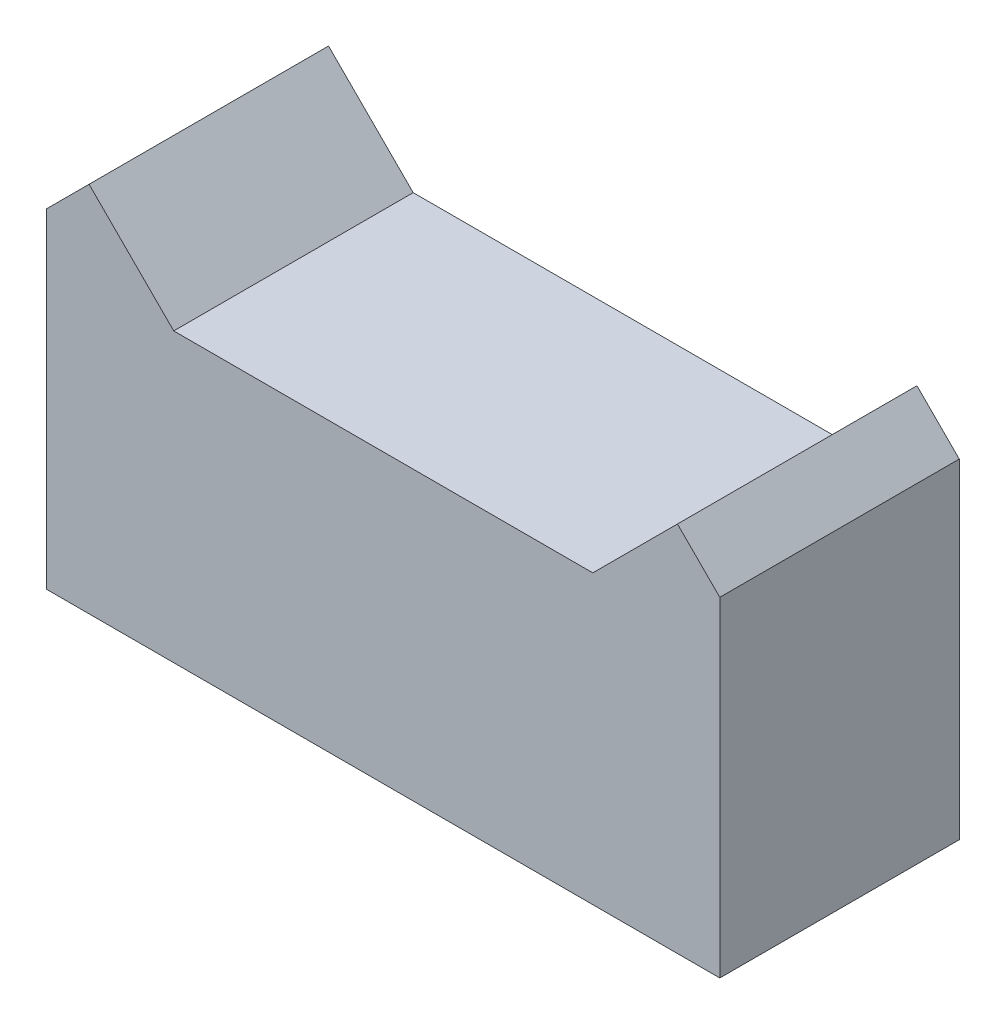
ISO-10303-21;
HEADER;
FILE_DESCRIPTION(('STEP AP214'),'2;1');
FILE_NAME('part.step','',(''),(''),'','','');
FILE_SCHEMA(('AUTOMOTIVE_DESIGN { 1 0 10303 214 1 1 1 1 }'));
ENDSEC;
DATA;
#1=APPLICATION_CONTEXT('core data for automotive mechanical design processes');
#2=APPLICATION_PROTOCOL_DEFINITION('international standard','automotive_design',2000,#1);
#3=PRODUCT_CONTEXT('',#1,'mechanical');
#4=PRODUCT('Part','Part','',(#3));
#5=PRODUCT_RELATED_PRODUCT_CATEGORY('part','',(#4));
#6=PRODUCT_DEFINITION_FORMATION('','',#4);
#7=PRODUCT_DEFINITION_CONTEXT('part definition',#1,'design');
#8=PRODUCT_DEFINITION('design','',#6,#7);
#9=PRODUCT_DEFINITION_SHAPE('','',#8);
#10=(LENGTH_UNIT() NAMED_UNIT(*) SI_UNIT(.MILLI.,.METRE.));
#11=(NAMED_UNIT(*) PLANE_ANGLE_UNIT() SI_UNIT($,.RADIAN.));
#12=(NAMED_UNIT(*) SI_UNIT($,.STERADIAN.) SOLID_ANGLE_UNIT());
#13=UNCERTAINTY_MEASURE_WITH_UNIT(LENGTH_MEASURE(1.E-05),#10,'distance_accuracy_value','');
#14=(GEOMETRIC_REPRESENTATION_CONTEXT(3) GLOBAL_UNCERTAINTY_ASSIGNED_CONTEXT((#13)) GLOBAL_UNIT_ASSIGNED_CONTEXT((#10,
#11,#12)) REPRESENTATION_CONTEXT('',''));
#15=CARTESIAN_POINT('',(0.,0.,0.));
#16=DIRECTION('',(0.,0.,1.));
#17=DIRECTION('',(1.,0.,0.));
#18=AXIS2_PLACEMENT_3D('',#15,#16,#17);
#19=CARTESIAN_POINT('',(0.,0.,-10.));
#20=DIRECTION('',(0.,0.,1.));
#21=DIRECTION('',(1.,0.,0.));
#22=AXIS2_PLACEMENT_3D('',#19,#20,#21);
#23=PLANE('',#22);
#24=DIRECTION('',(1.,0.,0.));
#25=VECTOR('',#24,1.);
#26=CARTESIAN_POINT('',(0.,-45.,-10.));
#27=LINE('',#26,#25);
#28=CARTESIAN_POINT('',(-28.1066017177982,-45.,-10.));
#29=VERTEX_POINT('',#28);
#30=CARTESIAN_POINT('',(28.1066017177982,-45.,-10.));
#31=VERTEX_POINT('',#30);
#32=EDGE_CURVE('E188',#29,#31,#27,.T.);
#33=ORIENTED_EDGE('',*,*,#32,.F.);
#34=DIRECTION('',(0.,-1.,0.));
#35=VECTOR('',#34,1.);
#36=CARTESIAN_POINT('',(-28.1066017177982,0.,-10.));
#37=LINE('',#36,#35);
#38=CARTESIAN_POINT('',(-28.1066017177982,-17.4644660940672,-10.));
#39=VERTEX_POINT('',#38);
#40=EDGE_CURVE('E204',#39,#29,#37,.T.);
#41=ORIENTED_EDGE('',*,*,#40,.F.);
#42=DIRECTION('',(-0.707106781186548,-0.707106781186548,0.));
#43=VECTOR('',#42,1.);
#44=CARTESIAN_POINT('',(-5.32106781186547,5.32106781186547,-10.));
#45=LINE('',#44,#43);
#46=CARTESIAN_POINT('',(-24.5710678118655,-13.9289321881345,-10.));
#47=VERTEX_POINT('',#46);
#48=EDGE_CURVE('E201',#47,#39,#45,.T.);
#49=ORIENTED_EDGE('',*,*,#48,.F.);
#50=DIRECTION('',(-0.707106781186548,0.707106781186547,0.));
#51=VECTOR('',#50,1.);
#52=CARTESIAN_POINT('',(-19.25,-19.25,-10.));
#53=LINE('',#52,#51);
#54=CARTESIAN_POINT('',(-17.5,-21.,-10.));
#55=VERTEX_POINT('',#54);
#56=EDGE_CURVE('E198',#55,#47,#53,.T.);
#57=ORIENTED_EDGE('',*,*,#56,.F.);
#58=DIRECTION('',(1.,0.,0.));
#59=VECTOR('',#58,1.);
#60=CARTESIAN_POINT('',(0.,-21.,-10.));
#61=LINE('',#60,#59);
#62=CARTESIAN_POINT('',(17.5,-21.,-10.));
#63=VERTEX_POINT('',#62);
#64=EDGE_CURVE('E196',#55,#63,#61,.T.);
#65=ORIENTED_EDGE('',*,*,#64,.T.);
#66=DIRECTION('',(0.707106781186548,0.707106781186548,0.));
#67=VECTOR('',#66,1.);
#68=CARTESIAN_POINT('',(19.25,-19.25,-10.));
#69=LINE('',#68,#67);
#70=CARTESIAN_POINT('',(24.5710678118655,-13.9289321881345,-10.));
#71=VERTEX_POINT('',#70);
#72=EDGE_CURVE('E194',#63,#71,#69,.T.);
#73=ORIENTED_EDGE('',*,*,#72,.T.);
#74=DIRECTION('',(0.707106781186548,-0.707106781186547,0.));
#75=VECTOR('',#74,1.);
#76=CARTESIAN_POINT('',(5.32106781186547,5.32106781186547,-10.));
#77=LINE('',#76,#75);
#78=CARTESIAN_POINT('',(28.1066017177982,-17.4644660940673,-10.));
#79=VERTEX_POINT('',#78);
#80=EDGE_CURVE('E192',#71,#79,#77,.T.);
#81=ORIENTED_EDGE('',*,*,#80,.T.);
#82=DIRECTION('',(0.,-1.,0.));
#83=VECTOR('',#82,1.);
#84=CARTESIAN_POINT('',(28.1066017177982,0.,-10.));
#85=LINE('',#84,#83);
#86=EDGE_CURVE('E190',#79,#31,#85,.T.);
#87=ORIENTED_EDGE('',*,*,#86,.T.);
#88=EDGE_LOOP('',(#33,#41,#49,#57,#65,#73,#81,#87));
#89=FACE_BOUND('',#88,.T.);
#90=DIRECTION('',(-1.,0.,0.));
#91=VECTOR('',#90,1.);
#92=CARTESIAN_POINT('',(0.,-33.,-10.));
#93=LINE('',#92,#91);
#94=CARTESIAN_POINT('',(9.98477558685093,-33.,-10.));
#95=VERTEX_POINT('',#94);
#96=CARTESIAN_POINT('',(-10.,-33.,-10.));
#97=VERTEX_POINT('',#96);
#98=EDGE_CURVE('E53',#95,#97,#93,.T.);
#99=ORIENTED_EDGE('',*,*,#98,.T.);
#100=DIRECTION('',(0.,-1.,0.));
#101=VECTOR('',#100,1.);
#102=CARTESIAN_POINT('',(-10.,0.,-10.));
#103=LINE('',#102,#101);
#104=CARTESIAN_POINT('',(-10.,-36.,-10.));
#105=VERTEX_POINT('',#104);
#106=EDGE_CURVE('E146',#97,#105,#103,.T.);
#107=ORIENTED_EDGE('',*,*,#106,.T.);
#108=DIRECTION('',(1.,0.,0.));
#109=VECTOR('',#108,1.);
#110=CARTESIAN_POINT('',(0.,-36.,-10.));
#111=LINE('',#110,#109);
#112=CARTESIAN_POINT('',(9.98477558685093,-36.,-10.));
#113=VERTEX_POINT('',#112);
#114=EDGE_CURVE('E149',#105,#113,#111,.T.);
#115=ORIENTED_EDGE('',*,*,#114,.T.);
#116=DIRECTION('',(0.,1.,0.));
#117=VECTOR('',#116,1.);
#118=CARTESIAN_POINT('',(9.98477558685093,0.,-10.));
#119=LINE('',#118,#117);
#120=EDGE_CURVE('E155',#113,#95,#119,.T.);
#121=ORIENTED_EDGE('',*,*,#120,.T.);
#122=EDGE_LOOP('',(#99,#107,#115,#121));
#123=FACE_BOUND('',#122,.T.);
#124=ADVANCED_FACE('F36',(#89,#123),#23,.F.);
#125=CARTESIAN_POINT('',(0.,-45.,-10.));
#126=DIRECTION('',(0.,-1.,0.));
#127=DIRECTION('',(0.,0.,-1.));
#128=AXIS2_PLACEMENT_3D('',#125,#126,#127);
#129=PLANE('',#128);
#130=DIRECTION('',(0.,0.,1.));
#131=VECTOR('',#130,1.);
#132=CARTESIAN_POINT('',(28.1066017177982,-45.,-10.));
#133=LINE('',#132,#131);
#134=CARTESIAN_POINT('',(28.1066017177982,-45.,10.));
#135=VERTEX_POINT('',#134);
#136=EDGE_CURVE('E40',#31,#135,#133,.T.);
#137=ORIENTED_EDGE('',*,*,#136,.T.);
#138=DIRECTION('',(1.,0.,0.));
#139=VECTOR('',#138,1.);
#140=CARTESIAN_POINT('',(0.,-45.,10.));
#141=LINE('',#140,#139);
#142=CARTESIAN_POINT('',(-28.1066017177982,-45.,10.));
#143=VERTEX_POINT('',#142);
#144=EDGE_CURVE('E161',#143,#135,#141,.T.);
#145=ORIENTED_EDGE('',*,*,#144,.F.);
#146=DIRECTION('',(0.,0.,1.));
#147=VECTOR('',#146,1.);
#148=CARTESIAN_POINT('',(-28.1066017177982,-45.,-10.));
#149=LINE('',#148,#147);
#150=EDGE_CURVE('E11',#29,#143,#149,.T.);
#151=ORIENTED_EDGE('',*,*,#150,.F.);
#152=ORIENTED_EDGE('',*,*,#32,.T.);
#153=EDGE_LOOP('',(#137,#145,#151,#152));
#154=FACE_BOUND('',#153,.T.);
#155=ADVANCED_FACE('F38',(#154),#129,.T.);
#156=CARTESIAN_POINT('',(-28.1066017177982,0.,-10.));
#157=DIRECTION('',(-1.,0.,0.));
#158=DIRECTION('',(0.,-1.,0.));
#159=AXIS2_PLACEMENT_3D('',#156,#157,#158);
#160=PLANE('',#159);
#161=ORIENTED_EDGE('',*,*,#150,.T.);
#162=DIRECTION('',(0.,-1.,0.));
#163=VECTOR('',#162,1.);
#164=CARTESIAN_POINT('',(-28.1066017177982,0.,10.));
#165=LINE('',#164,#163);
#166=CARTESIAN_POINT('',(-28.1066017177982,-17.4644660940672,10.));
#167=VERTEX_POINT('',#166);
#168=EDGE_CURVE('E185',#167,#143,#165,.T.);
#169=ORIENTED_EDGE('',*,*,#168,.F.);
#170=DIRECTION('',(0.,0.,1.));
#171=VECTOR('',#170,1.);
#172=CARTESIAN_POINT('',(-28.1066017177982,-17.4644660940672,-10.));
#173=LINE('',#172,#171);
#174=EDGE_CURVE('E45',#39,#167,#173,.T.);
#175=ORIENTED_EDGE('',*,*,#174,.F.);
#176=ORIENTED_EDGE('',*,*,#40,.T.);
#177=EDGE_LOOP('',(#161,#169,#175,#176));
#178=FACE_BOUND('',#177,.T.);
#179=ADVANCED_FACE('F242',(#178),#160,.T.);
#180=CARTESIAN_POINT('',(-5.32106781186547,5.32106781186547,-10.));
#181=DIRECTION('',(-0.707106781186548,0.707106781186548,0.));
#182=DIRECTION('',(-0.707106781186548,-0.707106781186548,0.));
#183=AXIS2_PLACEMENT_3D('',#180,#181,#182);
#184=PLANE('',#183);
#185=ORIENTED_EDGE('',*,*,#174,.T.);
#186=DIRECTION('',(-0.707106781186548,-0.707106781186548,0.));
#187=VECTOR('',#186,1.);
#188=CARTESIAN_POINT('',(-5.32106781186547,5.32106781186547,10.));
#189=LINE('',#188,#187);
#190=CARTESIAN_POINT('',(-24.5710678118655,-13.9289321881345,10.));
#191=VERTEX_POINT('',#190);
#192=EDGE_CURVE('E182',#191,#167,#189,.T.);
#193=ORIENTED_EDGE('',*,*,#192,.F.);
#194=DIRECTION('',(0.,0.,1.));
#195=VECTOR('',#194,1.);
#196=CARTESIAN_POINT('',(-24.5710678118655,-13.9289321881345,-10.));
#197=LINE('',#196,#195);
#198=EDGE_CURVE('E208',#47,#191,#197,.T.);
#199=ORIENTED_EDGE('',*,*,#198,.F.);
#200=ORIENTED_EDGE('',*,*,#48,.T.);
#201=EDGE_LOOP('',(#185,#193,#199,#200));
#202=FACE_BOUND('',#201,.T.);
#203=ADVANCED_FACE('F248',(#202),#184,.T.);
#204=CARTESIAN_POINT('',(-19.25,-19.25,-10.));
#205=DIRECTION('',(0.707106781186547,0.707106781186548,0.));
#206=DIRECTION('',(-0.707106781186548,0.707106781186547,0.));
#207=AXIS2_PLACEMENT_3D('',#204,#205,#206);
#208=PLANE('',#207);
#209=ORIENTED_EDGE('',*,*,#198,.T.);
#210=DIRECTION('',(-0.707106781186548,0.707106781186547,0.));
#211=VECTOR('',#210,1.);
#212=CARTESIAN_POINT('',(-19.25,-19.25,10.));
#213=LINE('',#212,#211);
#214=CARTESIAN_POINT('',(-17.5,-21.,10.));
#215=VERTEX_POINT('',#214);
#216=EDGE_CURVE('E179',#215,#191,#213,.T.);
#217=ORIENTED_EDGE('',*,*,#216,.F.);
#218=DIRECTION('',(0.,0.,1.));
#219=VECTOR('',#218,1.);
#220=CARTESIAN_POINT('',(-17.5,-21.,-10.));
#221=LINE('',#220,#219);
#222=EDGE_CURVE('E210',#55,#215,#221,.T.);
#223=ORIENTED_EDGE('',*,*,#222,.F.);
#224=ORIENTED_EDGE('',*,*,#56,.T.);
#225=EDGE_LOOP('',(#209,#217,#223,#224));
#226=FACE_BOUND('',#225,.T.);
#227=ADVANCED_FACE('F252',(#226),#208,.T.);
#228=CARTESIAN_POINT('',(0.,-21.,-10.));
#229=DIRECTION('',(0.,-1.,0.));
#230=DIRECTION('',(0.,0.,-1.));
#231=AXIS2_PLACEMENT_3D('',#228,#229,#230);
#232=PLANE('',#231);
#233=ORIENTED_EDGE('',*,*,#222,.T.);
#234=DIRECTION('',(1.,0.,0.));
#235=VECTOR('',#234,1.);
#236=CARTESIAN_POINT('',(0.,-21.,10.));
#237=LINE('',#236,#235);
#238=CARTESIAN_POINT('',(17.5,-21.,10.));
#239=VERTEX_POINT('',#238);
#240=EDGE_CURVE('E176',#215,#239,#237,.T.);
#241=ORIENTED_EDGE('',*,*,#240,.T.);
#242=DIRECTION('',(0.,0.,1.));
#243=VECTOR('',#242,1.);
#244=CARTESIAN_POINT('',(17.5,-21.,-10.));
#245=LINE('',#244,#243);
#246=EDGE_CURVE('E212',#63,#239,#245,.T.);
#247=ORIENTED_EDGE('',*,*,#246,.F.);
#248=ORIENTED_EDGE('',*,*,#64,.F.);
#249=EDGE_LOOP('',(#233,#241,#247,#248));
#250=FACE_BOUND('',#249,.T.);
#251=ADVANCED_FACE('F256',(#250),#232,.F.);
#252=CARTESIAN_POINT('',(19.25,-19.25,-10.));
#253=DIRECTION('',(0.707106781186548,-0.707106781186548,0.));
#254=DIRECTION('',(0.707106781186548,0.707106781186548,0.));
#255=AXIS2_PLACEMENT_3D('',#252,#253,#254);
#256=PLANE('',#255);
#257=ORIENTED_EDGE('',*,*,#246,.T.);
#258=DIRECTION('',(0.707106781186548,0.707106781186548,0.));
#259=VECTOR('',#258,1.);
#260=CARTESIAN_POINT('',(19.25,-19.25,10.));
#261=LINE('',#260,#259);
#262=CARTESIAN_POINT('',(24.5710678118655,-13.9289321881345,10.));
#263=VERTEX_POINT('',#262);
#264=EDGE_CURVE('E173',#239,#263,#261,.T.);
#265=ORIENTED_EDGE('',*,*,#264,.T.);
#266=DIRECTION('',(0.,0.,1.));
#267=VECTOR('',#266,1.);
#268=CARTESIAN_POINT('',(24.5710678118655,-13.9289321881345,-10.));
#269=LINE('',#268,#267);
#270=EDGE_CURVE('E214',#71,#263,#269,.T.);
#271=ORIENTED_EDGE('',*,*,#270,.F.);
#272=ORIENTED_EDGE('',*,*,#72,.F.);
#273=EDGE_LOOP('',(#257,#265,#271,#272));
#274=FACE_BOUND('',#273,.T.);
#275=ADVANCED_FACE('F233',(#274),#256,.F.);
#276=CARTESIAN_POINT('',(5.32106781186547,5.32106781186547,-10.));
#277=DIRECTION('',(-0.707106781186547,-0.707106781186548,0.));
#278=DIRECTION('',(0.707106781186548,-0.707106781186547,0.));
#279=AXIS2_PLACEMENT_3D('',#276,#277,#278);
#280=PLANE('',#279);
#281=ORIENTED_EDGE('',*,*,#270,.T.);
#282=DIRECTION('',(0.707106781186548,-0.707106781186547,0.));
#283=VECTOR('',#282,1.);
#284=CARTESIAN_POINT('',(5.32106781186547,5.32106781186547,10.));
#285=LINE('',#284,#283);
#286=CARTESIAN_POINT('',(28.1066017177982,-17.4644660940673,10.));
#287=VERTEX_POINT('',#286);
#288=EDGE_CURVE('E170',#263,#287,#285,.T.);
#289=ORIENTED_EDGE('',*,*,#288,.T.);
#290=DIRECTION('',(0.,0.,1.));
#291=VECTOR('',#290,1.);
#292=CARTESIAN_POINT('',(28.1066017177982,-17.4644660940673,-10.));
#293=LINE('',#292,#291);
#294=EDGE_CURVE('E215',#79,#287,#293,.T.);
#295=ORIENTED_EDGE('',*,*,#294,.F.);
#296=ORIENTED_EDGE('',*,*,#80,.F.);
#297=EDGE_LOOP('',(#281,#289,#295,#296));
#298=FACE_BOUND('',#297,.T.);
#299=ADVANCED_FACE('F227',(#298),#280,.F.);
#300=CARTESIAN_POINT('',(28.1066017177982,0.,-10.));
#301=DIRECTION('',(-1.,0.,0.));
#302=DIRECTION('',(0.,-1.,0.));
#303=AXIS2_PLACEMENT_3D('',#300,#301,#302);
#304=PLANE('',#303);
#305=ORIENTED_EDGE('',*,*,#294,.T.);
#306=DIRECTION('',(0.,-1.,0.));
#307=VECTOR('',#306,1.);
#308=CARTESIAN_POINT('',(28.1066017177982,0.,10.));
#309=LINE('',#308,#307);
#310=EDGE_CURVE('E167',#287,#135,#309,.T.);
#311=ORIENTED_EDGE('',*,*,#310,.T.);
#312=ORIENTED_EDGE('',*,*,#136,.F.);
#313=ORIENTED_EDGE('',*,*,#86,.F.);
#314=EDGE_LOOP('',(#305,#311,#312,#313));
#315=FACE_BOUND('',#314,.T.);
#316=ADVANCED_FACE('F225',(#315),#304,.F.);
#317=CARTESIAN_POINT('',(0.,0.,10.));
#318=DIRECTION('',(0.,0.,1.));
#319=DIRECTION('',(1.,0.,0.));
#320=AXIS2_PLACEMENT_3D('',#317,#318,#319);
#321=PLANE('',#320);
#322=ORIENTED_EDGE('',*,*,#144,.T.);
#323=ORIENTED_EDGE('',*,*,#310,.F.);
#324=ORIENTED_EDGE('',*,*,#288,.F.);
#325=ORIENTED_EDGE('',*,*,#264,.F.);
#326=ORIENTED_EDGE('',*,*,#240,.F.);
#327=ORIENTED_EDGE('',*,*,#216,.T.);
#328=ORIENTED_EDGE('',*,*,#192,.T.);
#329=ORIENTED_EDGE('',*,*,#168,.T.);
#330=EDGE_LOOP('',(#322,#323,#324,#325,#326,#327,#328,#329));
#331=FACE_BOUND('',#330,.T.);
#332=ADVANCED_FACE('F222',(#331),#321,.T.);
#333=CARTESIAN_POINT('',(0.,-33.,0.));
#334=DIRECTION('',(0.,-1.,0.));
#335=DIRECTION('',(0.,0.,-1.));
#336=AXIS2_PLACEMENT_3D('',#333,#334,#335);
#337=PLANE('',#336);
#338=ORIENTED_EDGE('',*,*,#98,.F.);
#339=DIRECTION('',(0.,0.,-1.));
#340=VECTOR('',#339,1.);
#341=CARTESIAN_POINT('',(9.98477558685093,-33.,0.));
#342=LINE('',#341,#340);
#343=CARTESIAN_POINT('',(9.98477558685093,-33.,0.));
#344=VERTEX_POINT('',#343);
#345=EDGE_CURVE('E131',#344,#95,#342,.T.);
#346=ORIENTED_EDGE('',*,*,#345,.F.);
#347=DIRECTION('',(-1.,0.,0.));
#348=VECTOR('',#347,1.);
#349=CARTESIAN_POINT('',(0.,-33.,0.));
#350=LINE('',#349,#348);
#351=CARTESIAN_POINT('',(-10.,-33.,0.));
#352=VERTEX_POINT('',#351);
#353=EDGE_CURVE('E138',#344,#352,#350,.T.);
#354=ORIENTED_EDGE('',*,*,#353,.T.);
#355=DIRECTION('',(0.,0.,-1.));
#356=VECTOR('',#355,1.);
#357=CARTESIAN_POINT('',(-10.,-33.,0.));
#358=LINE('',#357,#356);
#359=EDGE_CURVE('E159',#352,#97,#358,.T.);
#360=ORIENTED_EDGE('',*,*,#359,.T.);
#361=EDGE_LOOP('',(#338,#346,#354,#360));
#362=FACE_BOUND('',#361,.T.);
#363=ADVANCED_FACE('F141',(#362),#337,.T.);
#364=CARTESIAN_POINT('',(-10.,0.,0.));
#365=DIRECTION('',(1.,0.,0.));
#366=DIRECTION('',(0.,0.,-1.));
#367=AXIS2_PLACEMENT_3D('',#364,#365,#366);
#368=PLANE('',#367);
#369=ORIENTED_EDGE('',*,*,#106,.F.);
#370=ORIENTED_EDGE('',*,*,#359,.F.);
#371=DIRECTION('',(0.,-1.,0.));
#372=VECTOR('',#371,1.);
#373=CARTESIAN_POINT('',(-10.,0.,0.));
#374=LINE('',#373,#372);
#375=CARTESIAN_POINT('',(-10.,-36.,0.));
#376=VERTEX_POINT('',#375);
#377=EDGE_CURVE('E143',#352,#376,#374,.T.);
#378=ORIENTED_EDGE('',*,*,#377,.T.);
#379=DIRECTION('',(0.,0.,-1.));
#380=VECTOR('',#379,1.);
#381=CARTESIAN_POINT('',(-10.,-36.,0.));
#382=LINE('',#381,#380);
#383=EDGE_CURVE('E162',#376,#105,#382,.T.);
#384=ORIENTED_EDGE('',*,*,#383,.T.);
#385=EDGE_LOOP('',(#369,#370,#378,#384));
#386=FACE_BOUND('',#385,.T.);
#387=ADVANCED_FACE('F311',(#386),#368,.T.);
#388=CARTESIAN_POINT('',(0.,-36.,0.));
#389=DIRECTION('',(0.,1.,0.));
#390=DIRECTION('',(0.,0.,1.));
#391=AXIS2_PLACEMENT_3D('',#388,#389,#390);
#392=PLANE('',#391);
#393=ORIENTED_EDGE('',*,*,#114,.F.);
#394=ORIENTED_EDGE('',*,*,#383,.F.);
#395=DIRECTION('',(1.,0.,0.));
#396=VECTOR('',#395,1.);
#397=CARTESIAN_POINT('',(0.,-36.,0.));
#398=LINE('',#397,#396);
#399=CARTESIAN_POINT('',(9.98477558685093,-36.,0.));
#400=VERTEX_POINT('',#399);
#401=EDGE_CURVE('E137',#376,#400,#398,.T.);
#402=ORIENTED_EDGE('',*,*,#401,.T.);
#403=DIRECTION('',(0.,0.,-1.));
#404=VECTOR('',#403,1.);
#405=CARTESIAN_POINT('',(9.98477558685093,-36.,0.));
#406=LINE('',#405,#404);
#407=EDGE_CURVE('E133',#400,#113,#406,.T.);
#408=ORIENTED_EDGE('',*,*,#407,.T.);
#409=EDGE_LOOP('',(#393,#394,#402,#408));
#410=FACE_BOUND('',#409,.T.);
#411=ADVANCED_FACE('F319',(#410),#392,.T.);
#412=CARTESIAN_POINT('',(9.98477558685093,0.,0.));
#413=DIRECTION('',(-1.,0.,0.));
#414=DIRECTION('',(0.,0.,1.));
#415=AXIS2_PLACEMENT_3D('',#412,#413,#414);
#416=PLANE('',#415);
#417=ORIENTED_EDGE('',*,*,#120,.F.);
#418=ORIENTED_EDGE('',*,*,#407,.F.);
#419=DIRECTION('',(0.,1.,0.));
#420=VECTOR('',#419,1.);
#421=CARTESIAN_POINT('',(9.98477558685093,0.,0.));
#422=LINE('',#421,#420);
#423=EDGE_CURVE('E128',#400,#344,#422,.T.);
#424=ORIENTED_EDGE('',*,*,#423,.T.);
#425=ORIENTED_EDGE('',*,*,#345,.T.);
#426=EDGE_LOOP('',(#417,#418,#424,#425));
#427=FACE_BOUND('',#426,.T.);
#428=ADVANCED_FACE('F130',(#427),#416,.T.);
#429=CARTESIAN_POINT('',(0.,0.,0.));
#430=DIRECTION('',(0.,0.,-1.));
#431=DIRECTION('',(-1.,0.,0.));
#432=AXIS2_PLACEMENT_3D('',#429,#430,#431);
#433=PLANE('',#432);
#434=ORIENTED_EDGE('',*,*,#353,.F.);
#435=ORIENTED_EDGE('',*,*,#423,.F.);
#436=ORIENTED_EDGE('',*,*,#401,.F.);
#437=ORIENTED_EDGE('',*,*,#377,.F.);
#438=EDGE_LOOP('',(#434,#435,#436,#437));
#439=FACE_BOUND('',#438,.T.);
#440=ADVANCED_FACE('F145',(#439),#433,.T.);
#441=CLOSED_SHELL('',(#124,#155,#179,#203,#227,#251,#275,#299,#316,#332,#363,#387,#411,#428,#440));
#442=MANIFOLD_SOLID_BREP('B2',#441);
#443=ADVANCED_BREP_SHAPE_REPRESENTATION('',(#18,#442),#14);
#444=SHAPE_DEFINITION_REPRESENTATION(#9,#443);
ENDSEC;
END-ISO-10303-21;
